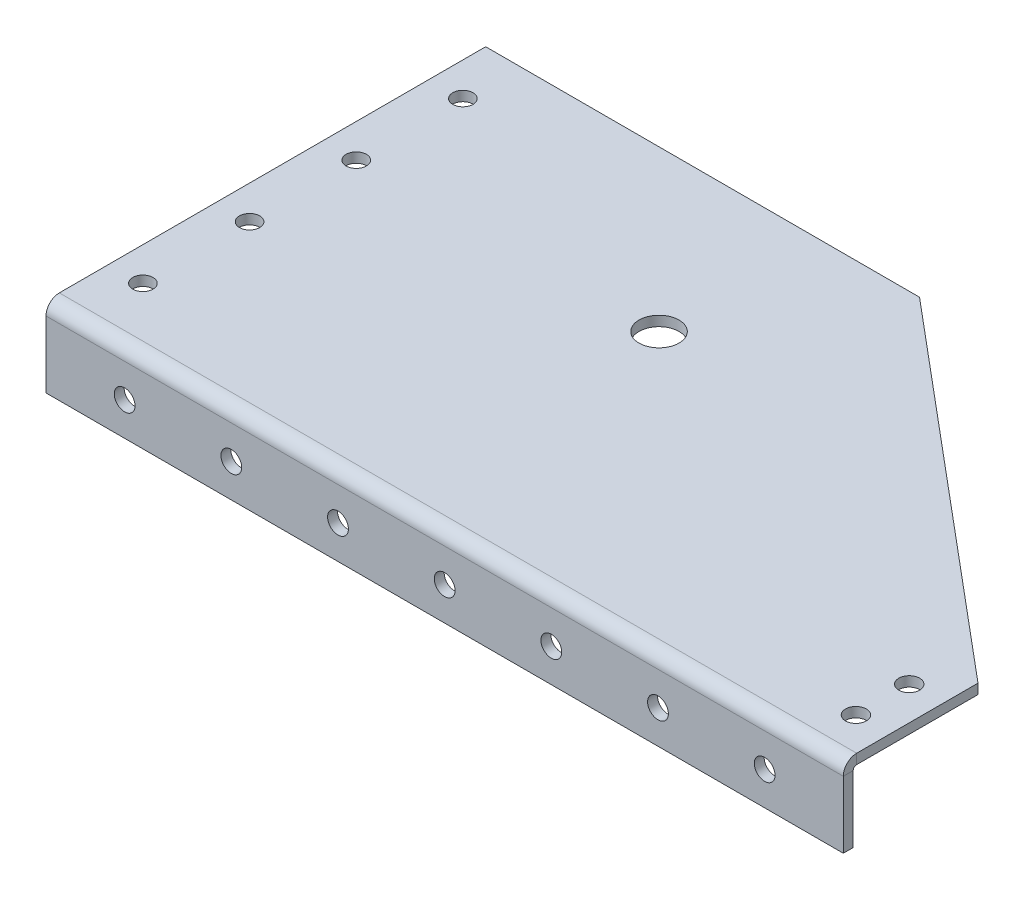
ISO-10303-21;
HEADER;
FILE_DESCRIPTION(('STEP AP214'),'2;1');
FILE_NAME('part.step','',(''),(''),'','','');
FILE_SCHEMA(('AUTOMOTIVE_DESIGN { 1 0 10303 214 1 1 1 1 }'));
ENDSEC;
DATA;
#1=APPLICATION_CONTEXT('core data for automotive mechanical design processes');
#2=APPLICATION_PROTOCOL_DEFINITION('international standard','automotive_design',2000,#1);
#3=PRODUCT_CONTEXT('',#1,'mechanical');
#4=PRODUCT('Part','Part','',(#3));
#5=PRODUCT_RELATED_PRODUCT_CATEGORY('part','',(#4));
#6=PRODUCT_DEFINITION_FORMATION('','',#4);
#7=PRODUCT_DEFINITION_CONTEXT('part definition',#1,'design');
#8=PRODUCT_DEFINITION('design','',#6,#7);
#9=PRODUCT_DEFINITION_SHAPE('','',#8);
#10=(LENGTH_UNIT() NAMED_UNIT(*) SI_UNIT(.MILLI.,.METRE.));
#11=(NAMED_UNIT(*) PLANE_ANGLE_UNIT() SI_UNIT($,.RADIAN.));
#12=(NAMED_UNIT(*) SI_UNIT($,.STERADIAN.) SOLID_ANGLE_UNIT());
#13=UNCERTAINTY_MEASURE_WITH_UNIT(LENGTH_MEASURE(1.E-05),#10,'distance_accuracy_value','');
#14=(GEOMETRIC_REPRESENTATION_CONTEXT(3) GLOBAL_UNCERTAINTY_ASSIGNED_CONTEXT((#13)) GLOBAL_UNIT_ASSIGNED_CONTEXT((#10,
#11,#12)) REPRESENTATION_CONTEXT('',''));
#15=CARTESIAN_POINT('',(0.,0.,0.));
#16=DIRECTION('',(0.,0.,1.));
#17=DIRECTION('',(1.,0.,0.));
#18=AXIS2_PLACEMENT_3D('',#15,#16,#17);
#19=CARTESIAN_POINT('',(-82.3158000000124,-2.3622,80.6769999999986));
#20=DIRECTION('',(-1.,0.,0.));
#21=DIRECTION('',(0.,0.,1.));
#22=AXIS2_PLACEMENT_3D('',#19,#20,#21);
#23=PLANE('',#22);
#24=DIRECTION('',(0.,0.,1.));
#25=VECTOR('',#24,1.);
#26=CARTESIAN_POINT('',(-82.3158000000124,0.,80.6769999999986));
#27=LINE('',#26,#25);
#28=CARTESIAN_POINT('',(-82.3158000000124,0.,-21.6596000000015));
#29=VERTEX_POINT('',#28);
#30=CARTESIAN_POINT('',(-82.3158000000124,0.,79.8641999999986));
#31=VERTEX_POINT('',#30);
#32=EDGE_CURVE('E195',#29,#31,#27,.T.);
#33=ORIENTED_EDGE('',*,*,#32,.F.);
#34=DIRECTION('',(0.,-1.,0.));
#35=VECTOR('',#34,1.);
#36=CARTESIAN_POINT('',(-82.3158000000124,0.,-21.6596000000015));
#37=LINE('',#36,#35);
#38=CARTESIAN_POINT('',(-82.3158000000124,-2.3622,-21.6596000000015));
#39=VERTEX_POINT('',#38);
#40=EDGE_CURVE('E123',#29,#39,#37,.T.);
#41=ORIENTED_EDGE('',*,*,#40,.T.);
#42=DIRECTION('',(0.,0.,1.));
#43=VECTOR('',#42,1.);
#44=CARTESIAN_POINT('',(-82.3158000000124,-2.3622,80.6769999999986));
#45=LINE('',#44,#43);
#46=CARTESIAN_POINT('',(-82.3158000000124,-2.36220000000001,79.8641999999985));
#47=VERTEX_POINT('',#46);
#48=EDGE_CURVE('E53',#39,#47,#45,.T.);
#49=ORIENTED_EDGE('',*,*,#48,.T.);
#50=DIRECTION('',(0.,1.,0.));
#51=VECTOR('',#50,1.);
#52=CARTESIAN_POINT('',(-82.3158000000124,-2.36220000000001,79.8641999999985));
#53=LINE('',#52,#51);
#54=EDGE_CURVE('E183',#47,#31,#53,.T.);
#55=ORIENTED_EDGE('',*,*,#54,.T.);
#56=EDGE_LOOP('',(#33,#41,#49,#55));
#57=FACE_BOUND('',#56,.T.);
#58=ADVANCED_FACE('F45',(#57),#23,.T.);
#59=CARTESIAN_POINT('',(0.,-2.3622,0.));
#60=DIRECTION('',(0.,1.,0.));
#61=DIRECTION('',(0.,0.,1.));
#62=AXIS2_PLACEMENT_3D('',#59,#60,#61);
#63=PLANE('',#62);
#64=CARTESIAN_POINT('',(-2.94080000001237,-2.3622,16.4403999999985));
#65=DIRECTION('',(0.,-1.,0.));
#66=DIRECTION('',(0.,0.,-1.));
#67=AXIS2_PLACEMENT_3D('',#64,#65,#66);
#68=CIRCLE('',#67,4.7625);
#69=CARTESIAN_POINT('',(-2.94080000001237,-2.3622,11.6778999999985));
#70=VERTEX_POINT('',#69);
#71=EDGE_CURVE('E331',#70,#70,#68,.T.);
#72=ORIENTED_EDGE('',*,*,#71,.F.);
#73=EDGE_LOOP('',(#72));
#74=FACE_BOUND('',#73,.T.);
#75=CARTESIAN_POINT('',(-74.3402000000121,-2.3622,-8.2596000000015));
#76=DIRECTION('',(0.,-1.,0.));
#77=DIRECTION('',(0.,0.,-1.));
#78=AXIS2_PLACEMENT_3D('',#75,#76,#77);
#79=CIRCLE('',#78,2.41300000000424);
#80=CARTESIAN_POINT('',(-74.3402000000121,-2.3622,-10.6726000000057));
#81=VERTEX_POINT('',#80);
#82=EDGE_CURVE('E339',#81,#81,#79,.T.);
#83=ORIENTED_EDGE('',*,*,#82,.F.);
#84=EDGE_LOOP('',(#83));
#85=FACE_BOUND('',#84,.T.);
#86=CARTESIAN_POINT('',(99.5657999997633,-2.3622,72.0664000001927));
#87=DIRECTION('',(0.,-1.,0.));
#88=DIRECTION('',(0.,0.,-1.));
#89=AXIS2_PLACEMENT_3D('',#86,#87,#88);
#90=CIRCLE('',#89,2.4765000002064);
#91=CARTESIAN_POINT('',(99.5657999997633,-2.3622,69.5898999999863));
#92=VERTEX_POINT('',#91);
#93=EDGE_CURVE('E332',#92,#92,#90,.T.);
#94=ORIENTED_EDGE('',*,*,#93,.F.);
#95=EDGE_LOOP('',(#94));
#96=FACE_BOUND('',#95,.T.);
#97=CARTESIAN_POINT('',(99.5657999997635,-2.3622,59.3664000001927));
#98=DIRECTION('',(0.,-1.,0.));
#99=DIRECTION('',(0.,0.,-1.));
#100=AXIS2_PLACEMENT_3D('',#97,#98,#99);
#101=CIRCLE('',#100,2.4765000002064);
#102=CARTESIAN_POINT('',(99.5657999997635,-2.3622,56.8898999999863));
#103=VERTEX_POINT('',#102);
#104=EDGE_CURVE('E348',#103,#103,#101,.T.);
#105=ORIENTED_EDGE('',*,*,#104,.F.);
#106=EDGE_LOOP('',(#105));
#107=FACE_BOUND('',#106,.T.);
#108=CARTESIAN_POINT('',(-74.3402000000129,-2.3622,67.9403999999985));
#109=DIRECTION('',(0.,-1.,0.));
#110=DIRECTION('',(0.,0.,-1.));
#111=AXIS2_PLACEMENT_3D('',#108,#109,#110);
#112=CIRCLE('',#111,2.41300000000423);
#113=CARTESIAN_POINT('',(-74.3402000000129,-2.3622,65.5273999999943));
#114=VERTEX_POINT('',#113);
#115=EDGE_CURVE('E364',#114,#114,#112,.T.);
#116=ORIENTED_EDGE('',*,*,#115,.F.);
#117=EDGE_LOOP('',(#116));
#118=FACE_BOUND('',#117,.T.);
#119=CARTESIAN_POINT('',(-74.3402000000127,-2.3622,42.5403999999985));
#120=DIRECTION('',(0.,-1.,0.));
#121=DIRECTION('',(0.,0.,-1.));
#122=AXIS2_PLACEMENT_3D('',#119,#120,#121);
#123=CIRCLE('',#122,2.41300000000424);
#124=CARTESIAN_POINT('',(-74.3402000000127,-2.3622,40.1273999999942));
#125=VERTEX_POINT('',#124);
#126=EDGE_CURVE('E358',#125,#125,#123,.T.);
#127=ORIENTED_EDGE('',*,*,#126,.F.);
#128=EDGE_LOOP('',(#127));
#129=FACE_BOUND('',#128,.T.);
#130=CARTESIAN_POINT('',(-74.3402000000124,-2.3622,17.1403999999985));
#131=DIRECTION('',(0.,-1.,0.));
#132=DIRECTION('',(0.,0.,-1.));
#133=AXIS2_PLACEMENT_3D('',#130,#131,#132);
#134=CIRCLE('',#133,2.41300000000424);
#135=CARTESIAN_POINT('',(-74.3402000000124,-2.3622,14.7273999999943));
#136=VERTEX_POINT('',#135);
#137=EDGE_CURVE('E352',#136,#136,#134,.T.);
#138=ORIENTED_EDGE('',*,*,#137,.F.);
#139=EDGE_LOOP('',(#138));
#140=FACE_BOUND('',#139,.T.);
#141=DIRECTION('',(0.766044443118979,0.,0.642787609686538));
#142=VECTOR('',#141,1.);
#143=CARTESIAN_POINT('',(19.3372412522365,-2.3622,-23.0452267332139));
#144=LINE('',#143,#142);
#145=CARTESIAN_POINT('',(20.9885668895371,-2.3622,-21.6596000000015));
#146=VERTEX_POINT('',#145);
#147=CARTESIAN_POINT('',(107.54140000001,-2.3622,50.966850340345));
#148=VERTEX_POINT('',#147);
#149=EDGE_CURVE('E129',#146,#148,#144,.T.);
#150=ORIENTED_EDGE('',*,*,#149,.T.);
#151=DIRECTION('',(0.,0.,-1.));
#152=VECTOR('',#151,1.);
#153=CARTESIAN_POINT('',(107.54140000001,-2.3622,80.6769999999985));
#154=LINE('',#153,#152);
#155=CARTESIAN_POINT('',(107.54140000001,-2.36220000000001,79.8641999999985));
#156=VERTEX_POINT('',#155);
#157=EDGE_CURVE('E11',#156,#148,#154,.T.);
#158=ORIENTED_EDGE('',*,*,#157,.F.);
#159=DIRECTION('',(-1.,0.,0.));
#160=VECTOR('',#159,1.);
#161=CARTESIAN_POINT('',(-82.3158000000124,-2.36220000000001,79.8641999999985));
#162=LINE('',#161,#160);
#163=EDGE_CURVE('E189',#47,#156,#162,.F.);
#164=ORIENTED_EDGE('',*,*,#163,.F.);
#165=ORIENTED_EDGE('',*,*,#48,.F.);
#166=DIRECTION('',(1.,0.,0.));
#167=VECTOR('',#166,1.);
#168=CARTESIAN_POINT('',(0.,-2.3622,-21.6596000000015));
#169=LINE('',#168,#167);
#170=EDGE_CURVE('E136',#39,#146,#169,.T.);
#171=ORIENTED_EDGE('',*,*,#170,.T.);
#172=EDGE_LOOP('',(#150,#158,#164,#165,#171));
#173=FACE_BOUND('',#172,.T.);
#174=ADVANCED_FACE('F209',(#74,#85,#96,#107,#118,#129,#140,#173),#63,.F.);
#175=CARTESIAN_POINT('',(0.,0.,0.));
#176=DIRECTION('',(0.,1.,0.));
#177=DIRECTION('',(0.,0.,1.));
#178=AXIS2_PLACEMENT_3D('',#175,#176,#177);
#179=PLANE('',#178);
#180=CARTESIAN_POINT('',(-2.94080000001237,0.,16.4403999999985));
#181=DIRECTION('',(0.,1.,0.));
#182=DIRECTION('',(0.,0.,1.));
#183=AXIS2_PLACEMENT_3D('',#180,#181,#182);
#184=CIRCLE('',#183,4.7625);
#185=CARTESIAN_POINT('',(-2.94080000001237,0.,21.2028999999985));
#186=VERTEX_POINT('',#185);
#187=EDGE_CURVE('E329',#186,#186,#184,.F.);
#188=ORIENTED_EDGE('',*,*,#187,.T.);
#189=EDGE_LOOP('',(#188));
#190=FACE_BOUND('',#189,.T.);
#191=CARTESIAN_POINT('',(-74.3402000000121,0.,-8.2596000000015));
#192=DIRECTION('',(0.,1.,0.));
#193=DIRECTION('',(0.,0.,1.));
#194=AXIS2_PLACEMENT_3D('',#191,#192,#193);
#195=CIRCLE('',#194,2.41300000000424);
#196=CARTESIAN_POINT('',(-74.3402000000121,0.,-5.84659999999725));
#197=VERTEX_POINT('',#196);
#198=EDGE_CURVE('E343',#197,#197,#195,.F.);
#199=ORIENTED_EDGE('',*,*,#198,.T.);
#200=EDGE_LOOP('',(#199));
#201=FACE_BOUND('',#200,.T.);
#202=CARTESIAN_POINT('',(99.5657999997633,0.,72.0664000001927));
#203=DIRECTION('',(0.,1.,0.));
#204=DIRECTION('',(0.,0.,1.));
#205=AXIS2_PLACEMENT_3D('',#202,#203,#204);
#206=CIRCLE('',#205,2.4765000002064);
#207=CARTESIAN_POINT('',(99.5657999997633,0.,74.5429000003991));
#208=VERTEX_POINT('',#207);
#209=EDGE_CURVE('E335',#208,#208,#206,.F.);
#210=ORIENTED_EDGE('',*,*,#209,.T.);
#211=EDGE_LOOP('',(#210));
#212=FACE_BOUND('',#211,.T.);
#213=CARTESIAN_POINT('',(99.5657999997635,0.,59.3664000001927));
#214=DIRECTION('',(0.,1.,0.));
#215=DIRECTION('',(0.,0.,1.));
#216=AXIS2_PLACEMENT_3D('',#213,#214,#215);
#217=CIRCLE('',#216,2.4765000002064);
#218=CARTESIAN_POINT('',(99.5657999997635,0.,61.8429000003991));
#219=VERTEX_POINT('',#218);
#220=EDGE_CURVE('E367',#219,#219,#217,.F.);
#221=ORIENTED_EDGE('',*,*,#220,.T.);
#222=EDGE_LOOP('',(#221));
#223=FACE_BOUND('',#222,.T.);
#224=CARTESIAN_POINT('',(-74.3402000000129,0.,67.9403999999985));
#225=DIRECTION('',(0.,1.,0.));
#226=DIRECTION('',(0.,0.,1.));
#227=AXIS2_PLACEMENT_3D('',#224,#225,#226);
#228=CIRCLE('',#227,2.41300000000423);
#229=CARTESIAN_POINT('',(-74.3402000000129,0.,70.3534000000027));
#230=VERTEX_POINT('',#229);
#231=EDGE_CURVE('E361',#230,#230,#228,.F.);
#232=ORIENTED_EDGE('',*,*,#231,.T.);
#233=EDGE_LOOP('',(#232));
#234=FACE_BOUND('',#233,.T.);
#235=CARTESIAN_POINT('',(-74.3402000000127,0.,42.5403999999985));
#236=DIRECTION('',(0.,1.,0.));
#237=DIRECTION('',(0.,0.,1.));
#238=AXIS2_PLACEMENT_3D('',#235,#236,#237);
#239=CIRCLE('',#238,2.41300000000424);
#240=CARTESIAN_POINT('',(-74.3402000000127,0.,44.9534000000027));
#241=VERTEX_POINT('',#240);
#242=EDGE_CURVE('E355',#241,#241,#239,.F.);
#243=ORIENTED_EDGE('',*,*,#242,.T.);
#244=EDGE_LOOP('',(#243));
#245=FACE_BOUND('',#244,.T.);
#246=CARTESIAN_POINT('',(-74.3402000000124,0.,17.1403999999985));
#247=DIRECTION('',(0.,1.,0.));
#248=DIRECTION('',(0.,0.,1.));
#249=AXIS2_PLACEMENT_3D('',#246,#247,#248);
#250=CIRCLE('',#249,2.41300000000424);
#251=CARTESIAN_POINT('',(-74.3402000000124,0.,19.5534000000027));
#252=VERTEX_POINT('',#251);
#253=EDGE_CURVE('E346',#252,#252,#250,.F.);
#254=ORIENTED_EDGE('',*,*,#253,.T.);
#255=EDGE_LOOP('',(#254));
#256=FACE_BOUND('',#255,.T.);
#257=DIRECTION('',(0.,0.,-1.));
#258=VECTOR('',#257,1.);
#259=CARTESIAN_POINT('',(107.54140000001,0.,80.6769999999985));
#260=LINE('',#259,#258);
#261=CARTESIAN_POINT('',(107.54140000001,0.,79.8641999999985));
#262=VERTEX_POINT('',#261);
#263=CARTESIAN_POINT('',(107.54140000001,0.,50.966850340345));
#264=VERTEX_POINT('',#263);
#265=EDGE_CURVE('E48',#262,#264,#260,.T.);
#266=ORIENTED_EDGE('',*,*,#265,.T.);
#267=DIRECTION('',(0.766044443118979,0.,0.642787609686538));
#268=VECTOR('',#267,1.);
#269=CARTESIAN_POINT('',(19.3372412522365,0.,-23.0452267332139));
#270=LINE('',#269,#268);
#271=CARTESIAN_POINT('',(20.9885668895371,0.,-21.6596000000015));
#272=VERTEX_POINT('',#271);
#273=EDGE_CURVE('E61',#272,#264,#270,.T.);
#274=ORIENTED_EDGE('',*,*,#273,.F.);
#275=DIRECTION('',(1.,0.,0.));
#276=VECTOR('',#275,1.);
#277=CARTESIAN_POINT('',(0.,0.,-21.6596000000015));
#278=LINE('',#277,#276);
#279=EDGE_CURVE('E118',#29,#272,#278,.T.);
#280=ORIENTED_EDGE('',*,*,#279,.F.);
#281=ORIENTED_EDGE('',*,*,#32,.T.);
#282=DIRECTION('',(-1.,0.,0.));
#283=VECTOR('',#282,1.);
#284=CARTESIAN_POINT('',(-82.3158000000124,0.,79.8641999999986));
#285=LINE('',#284,#283);
#286=EDGE_CURVE('E179',#31,#262,#285,.F.);
#287=ORIENTED_EDGE('',*,*,#286,.T.);
#288=EDGE_LOOP('',(#266,#274,#280,#281,#287));
#289=FACE_BOUND('',#288,.T.);
#290=ADVANCED_FACE('F133',(#190,#201,#212,#223,#234,#245,#256,#289),#179,.T.);
#291=CARTESIAN_POINT('',(107.54140000001,-2.3622,80.6769999999985));
#292=DIRECTION('',(1.,0.,0.));
#293=DIRECTION('',(0.,0.,-1.));
#294=AXIS2_PLACEMENT_3D('',#291,#292,#293);
#295=PLANE('',#294);
#296=ORIENTED_EDGE('',*,*,#157,.T.);
#297=DIRECTION('',(0.,-1.,0.));
#298=VECTOR('',#297,1.);
#299=CARTESIAN_POINT('',(107.54140000001,0.,50.966850340345));
#300=LINE('',#299,#298);
#301=EDGE_CURVE('E145',#264,#148,#300,.T.);
#302=ORIENTED_EDGE('',*,*,#301,.F.);
#303=ORIENTED_EDGE('',*,*,#265,.F.);
#304=DIRECTION('',(0.,1.,0.));
#305=VECTOR('',#304,1.);
#306=CARTESIAN_POINT('',(107.54140000001,-2.36220000000001,79.8641999999985));
#307=LINE('',#306,#305);
#308=EDGE_CURVE('E193',#156,#262,#307,.T.);
#309=ORIENTED_EDGE('',*,*,#308,.F.);
#310=EDGE_LOOP('',(#296,#302,#303,#309));
#311=FACE_BOUND('',#310,.T.);
#312=ADVANCED_FACE('F219',(#311),#295,.T.);
#313=CARTESIAN_POINT('',(107.54140000001,-3.175,79.8641999999985));
#314=DIRECTION('',(1.,0.,0.));
#315=DIRECTION('',(0.,0.,-1.));
#316=AXIS2_PLACEMENT_3D('',#313,#314,#315);
#317=PLANE('',#316);
#318=DIRECTION('',(0.,0.,1.));
#319=VECTOR('',#318,1.);
#320=CARTESIAN_POINT('',(107.54140000001,-3.175,80.6769999999985));
#321=LINE('',#320,#319);
#322=CARTESIAN_POINT('',(107.54140000001,-3.17499999999999,80.6769999999985));
#323=VERTEX_POINT('',#322);
#324=CARTESIAN_POINT('',(107.54140000001,-3.17499999999999,83.0391999999985));
#325=VERTEX_POINT('',#324);
#326=EDGE_CURVE('E147',#323,#325,#321,.T.);
#327=ORIENTED_EDGE('',*,*,#326,.F.);
#328=CARTESIAN_POINT('',(107.54140000001,-3.175,79.8641999999985));
#329=DIRECTION('',(-1.,0.,0.));
#330=DIRECTION('',(0.,0.,1.));
#331=AXIS2_PLACEMENT_3D('',#328,#329,#330);
#332=CIRCLE('',#331,0.812799999999989);
#333=EDGE_CURVE('E186',#156,#323,#332,.F.);
#334=ORIENTED_EDGE('',*,*,#333,.F.);
#335=ORIENTED_EDGE('',*,*,#308,.T.);
#336=CARTESIAN_POINT('',(107.54140000001,-3.175,79.8641999999985));
#337=DIRECTION('',(-1.,0.,0.));
#338=DIRECTION('',(0.,0.,1.));
#339=AXIS2_PLACEMENT_3D('',#336,#337,#338);
#340=CIRCLE('',#339,3.17499999999999);
#341=EDGE_CURVE('E69',#262,#325,#340,.F.);
#342=ORIENTED_EDGE('',*,*,#341,.T.);
#343=EDGE_LOOP('',(#327,#334,#335,#342));
#344=FACE_BOUND('',#343,.T.);
#345=ADVANCED_FACE('F217',(#344),#317,.T.);
#346=CARTESIAN_POINT('',(-82.3158000000124,-3.175,79.8641999999985));
#347=DIRECTION('',(1.,0.,0.));
#348=DIRECTION('',(0.,0.,-1.));
#349=AXIS2_PLACEMENT_3D('',#346,#347,#348);
#350=PLANE('',#349);
#351=CARTESIAN_POINT('',(-82.3158000000124,-3.175,79.8641999999985));
#352=DIRECTION('',(-1.,0.,0.));
#353=DIRECTION('',(0.,0.,1.));
#354=AXIS2_PLACEMENT_3D('',#351,#352,#353);
#355=CIRCLE('',#354,0.812799999999989);
#356=CARTESIAN_POINT('',(-82.3158000000124,-3.17499999999999,80.6769999999985));
#357=VERTEX_POINT('',#356);
#358=EDGE_CURVE('E178',#357,#47,#355,.T.);
#359=ORIENTED_EDGE('',*,*,#358,.F.);
#360=DIRECTION('',(0.,0.,1.));
#361=VECTOR('',#360,1.);
#362=CARTESIAN_POINT('',(-82.3158000000124,-3.175,80.6769999999986));
#363=LINE('',#362,#361);
#364=CARTESIAN_POINT('',(-82.3158000000124,-3.175,83.0391999999985));
#365=VERTEX_POINT('',#364);
#366=EDGE_CURVE('E151',#357,#365,#363,.T.);
#367=ORIENTED_EDGE('',*,*,#366,.T.);
#368=CARTESIAN_POINT('',(-82.3158000000124,-3.175,79.8641999999985));
#369=DIRECTION('',(-1.,0.,0.));
#370=DIRECTION('',(0.,0.,1.));
#371=AXIS2_PLACEMENT_3D('',#368,#369,#370);
#372=CIRCLE('',#371,3.17499999999999);
#373=EDGE_CURVE('E181',#365,#31,#372,.T.);
#374=ORIENTED_EDGE('',*,*,#373,.T.);
#375=ORIENTED_EDGE('',*,*,#54,.F.);
#376=EDGE_LOOP('',(#359,#367,#374,#375));
#377=FACE_BOUND('',#376,.T.);
#378=ADVANCED_FACE('F203',(#377),#350,.F.);
#379=CARTESIAN_POINT('',(-82.3158000000124,-3.175,79.8641999999985));
#380=DIRECTION('',(-1.,0.,0.));
#381=DIRECTION('',(0.,0.,1.));
#382=AXIS2_PLACEMENT_3D('',#379,#380,#381);
#383=CYLINDRICAL_SURFACE('',#382,3.17499999999999);
#384=ORIENTED_EDGE('',*,*,#286,.F.);
#385=ORIENTED_EDGE('',*,*,#373,.F.);
#386=DIRECTION('',(1.,0.,0.));
#387=VECTOR('',#386,1.);
#388=CARTESIAN_POINT('',(0.,-3.175,83.0391999999985));
#389=LINE('',#388,#387);
#390=EDGE_CURVE('E154',#365,#325,#389,.T.);
#391=ORIENTED_EDGE('',*,*,#390,.T.);
#392=ORIENTED_EDGE('',*,*,#341,.F.);
#393=EDGE_LOOP('',(#384,#385,#391,#392));
#394=FACE_BOUND('',#393,.T.);
#395=ADVANCED_FACE('F199',(#394),#383,.T.);
#396=CARTESIAN_POINT('',(-82.3158000000124,-3.175,79.8641999999985));
#397=DIRECTION('',(-1.,0.,0.));
#398=DIRECTION('',(0.,0.,1.));
#399=AXIS2_PLACEMENT_3D('',#396,#397,#398);
#400=CYLINDRICAL_SURFACE('',#399,0.812799999999989);
#401=ORIENTED_EDGE('',*,*,#163,.T.);
#402=ORIENTED_EDGE('',*,*,#333,.T.);
#403=DIRECTION('',(-1.,0.,0.));
#404=VECTOR('',#403,1.);
#405=CARTESIAN_POINT('',(107.54140000001,-3.175,80.6769999999985));
#406=LINE('',#405,#404);
#407=EDGE_CURVE('E149',#323,#357,#406,.T.);
#408=ORIENTED_EDGE('',*,*,#407,.T.);
#409=ORIENTED_EDGE('',*,*,#358,.T.);
#410=EDGE_LOOP('',(#401,#402,#408,#409));
#411=FACE_BOUND('',#410,.T.);
#412=ADVANCED_FACE('F213',(#411),#400,.F.);
#413=CARTESIAN_POINT('',(-82.3158000000124,-19.05,83.0391999999986));
#414=DIRECTION('',(1.,0.,0.));
#415=DIRECTION('',(0.,1.,0.));
#416=AXIS2_PLACEMENT_3D('',#413,#414,#415);
#417=PLANE('',#416);
#418=ORIENTED_EDGE('',*,*,#366,.F.);
#419=DIRECTION('',(0.,-1.,0.));
#420=VECTOR('',#419,1.);
#421=CARTESIAN_POINT('',(-82.3158000000124,-19.05,80.6769999999986));
#422=LINE('',#421,#420);
#423=CARTESIAN_POINT('',(-82.3158000000124,-19.05,80.6769999999986));
#424=VERTEX_POINT('',#423);
#425=EDGE_CURVE('E158',#357,#424,#422,.T.);
#426=ORIENTED_EDGE('',*,*,#425,.T.);
#427=DIRECTION('',(0.,0.,-1.));
#428=VECTOR('',#427,1.);
#429=CARTESIAN_POINT('',(-82.3158000000124,-19.05,83.0391999999986));
#430=LINE('',#429,#428);
#431=CARTESIAN_POINT('',(-82.3158000000124,-19.05,83.0391999999986));
#432=VERTEX_POINT('',#431);
#433=EDGE_CURVE('E175',#432,#424,#430,.T.);
#434=ORIENTED_EDGE('',*,*,#433,.F.);
#435=DIRECTION('',(0.,-1.,0.));
#436=VECTOR('',#435,1.);
#437=CARTESIAN_POINT('',(-82.3158000000124,-19.05,83.0391999999986));
#438=LINE('',#437,#436);
#439=EDGE_CURVE('E159',#365,#432,#438,.T.);
#440=ORIENTED_EDGE('',*,*,#439,.F.);
#441=EDGE_LOOP('',(#418,#426,#434,#440));
#442=FACE_BOUND('',#441,.T.);
#443=ADVANCED_FACE('F246',(#442),#417,.F.);
#444=CARTESIAN_POINT('',(107.54140000001,-2.36219999999999,83.0391999999985));
#445=DIRECTION('',(-1.,0.,0.));
#446=DIRECTION('',(0.,0.,1.));
#447=AXIS2_PLACEMENT_3D('',#444,#445,#446);
#448=PLANE('',#447);
#449=ORIENTED_EDGE('',*,*,#326,.T.);
#450=DIRECTION('',(0.,1.,0.));
#451=VECTOR('',#450,1.);
#452=CARTESIAN_POINT('',(107.54140000001,-2.36219999999999,83.0391999999985));
#453=LINE('',#452,#451);
#454=CARTESIAN_POINT('',(107.54140000001,-19.05,83.0391999999986));
#455=VERTEX_POINT('',#454);
#456=EDGE_CURVE('E164',#455,#325,#453,.T.);
#457=ORIENTED_EDGE('',*,*,#456,.F.);
#458=DIRECTION('',(0.,0.,-1.));
#459=VECTOR('',#458,1.);
#460=CARTESIAN_POINT('',(107.54140000001,-19.05,83.0391999999986));
#461=LINE('',#460,#459);
#462=CARTESIAN_POINT('',(107.54140000001,-19.05,80.6769999999986));
#463=VERTEX_POINT('',#462);
#464=EDGE_CURVE('E167',#455,#463,#461,.T.);
#465=ORIENTED_EDGE('',*,*,#464,.T.);
#466=DIRECTION('',(0.,1.,0.));
#467=VECTOR('',#466,1.);
#468=CARTESIAN_POINT('',(107.54140000001,-2.3622,80.6769999999985));
#469=LINE('',#468,#467);
#470=EDGE_CURVE('E162',#463,#323,#469,.T.);
#471=ORIENTED_EDGE('',*,*,#470,.T.);
#472=EDGE_LOOP('',(#449,#457,#465,#471));
#473=FACE_BOUND('',#472,.T.);
#474=ADVANCED_FACE('F251',(#473),#448,.F.);
#475=CARTESIAN_POINT('',(0.,2.76615675343239E-13,83.0391999999985));
#476=DIRECTION('',(0.,0.,-1.));
#477=DIRECTION('',(0.,1.,0.));
#478=AXIS2_PLACEMENT_3D('',#475,#476,#477);
#479=PLANE('',#478);
#480=CARTESIAN_POINT('',(-63.587200000001,-11.1125,83.0391999999986));
#481=DIRECTION('',(0.,0.,-1.));
#482=DIRECTION('',(0.,1.,0.));
#483=AXIS2_PLACEMENT_3D('',#480,#481,#482);
#484=CIRCLE('',#483,2.4765);
#485=CARTESIAN_POINT('',(-63.587200000001,-8.636,83.0391999999986));
#486=VERTEX_POINT('',#485);
#487=EDGE_CURVE('E143',#486,#486,#484,.F.);
#488=ORIENTED_EDGE('',*,*,#487,.F.);
#489=EDGE_LOOP('',(#488));
#490=FACE_BOUND('',#489,.T.);
#491=CARTESIAN_POINT('',(88.812799999999,-11.1125,83.0391999999986));
#492=DIRECTION('',(0.,0.,-1.));
#493=DIRECTION('',(0.,1.,0.));
#494=AXIS2_PLACEMENT_3D('',#491,#492,#493);
#495=CIRCLE('',#494,2.4765);
#496=CARTESIAN_POINT('',(88.812799999999,-8.636,83.0391999999985));
#497=VERTEX_POINT('',#496);
#498=EDGE_CURVE('E378',#497,#497,#495,.F.);
#499=ORIENTED_EDGE('',*,*,#498,.F.);
#500=EDGE_LOOP('',(#499));
#501=FACE_BOUND('',#500,.T.);
#502=CARTESIAN_POINT('',(63.412799999999,-11.1125,83.0391999999986));
#503=DIRECTION('',(0.,0.,-1.));
#504=DIRECTION('',(0.,1.,0.));
#505=AXIS2_PLACEMENT_3D('',#502,#503,#504);
#506=CIRCLE('',#505,2.4765);
#507=CARTESIAN_POINT('',(63.412799999999,-8.63600000000001,83.0391999999985));
#508=VERTEX_POINT('',#507);
#509=EDGE_CURVE('E384',#508,#508,#506,.F.);
#510=ORIENTED_EDGE('',*,*,#509,.F.);
#511=EDGE_LOOP('',(#510));
#512=FACE_BOUND('',#511,.T.);
#513=CARTESIAN_POINT('',(38.012799999999,-11.1125,83.0391999999986));
#514=DIRECTION('',(0.,0.,-1.));
#515=DIRECTION('',(0.,1.,0.));
#516=AXIS2_PLACEMENT_3D('',#513,#514,#515);
#517=CIRCLE('',#516,2.4765);
#518=CARTESIAN_POINT('',(38.012799999999,-8.63600000000001,83.0391999999985));
#519=VERTEX_POINT('',#518);
#520=EDGE_CURVE('E390',#519,#519,#517,.F.);
#521=ORIENTED_EDGE('',*,*,#520,.F.);
#522=EDGE_LOOP('',(#521));
#523=FACE_BOUND('',#522,.T.);
#524=CARTESIAN_POINT('',(12.612799999999,-11.1125,83.0391999999986));
#525=DIRECTION('',(0.,0.,-1.));
#526=DIRECTION('',(0.,1.,0.));
#527=AXIS2_PLACEMENT_3D('',#524,#525,#526);
#528=CIRCLE('',#527,2.4765);
#529=CARTESIAN_POINT('',(12.612799999999,-8.636,83.0391999999986));
#530=VERTEX_POINT('',#529);
#531=EDGE_CURVE('E396',#530,#530,#528,.F.);
#532=ORIENTED_EDGE('',*,*,#531,.F.);
#533=EDGE_LOOP('',(#532));
#534=FACE_BOUND('',#533,.T.);
#535=CARTESIAN_POINT('',(-12.787200000001,-11.1125,83.0391999999986));
#536=DIRECTION('',(0.,0.,-1.));
#537=DIRECTION('',(0.,1.,0.));
#538=AXIS2_PLACEMENT_3D('',#535,#536,#537);
#539=CIRCLE('',#538,2.4765);
#540=CARTESIAN_POINT('',(-12.787200000001,-8.636,83.0391999999986));
#541=VERTEX_POINT('',#540);
#542=EDGE_CURVE('E402',#541,#541,#539,.F.);
#543=ORIENTED_EDGE('',*,*,#542,.F.);
#544=EDGE_LOOP('',(#543));
#545=FACE_BOUND('',#544,.T.);
#546=CARTESIAN_POINT('',(-38.187200000001,-11.1125,83.0391999999986));
#547=DIRECTION('',(0.,0.,-1.));
#548=DIRECTION('',(0.,1.,0.));
#549=AXIS2_PLACEMENT_3D('',#546,#547,#548);
#550=CIRCLE('',#549,2.4765);
#551=CARTESIAN_POINT('',(-38.187200000001,-8.63600000000001,83.0391999999986));
#552=VERTEX_POINT('',#551);
#553=EDGE_CURVE('E342',#552,#552,#550,.F.);
#554=ORIENTED_EDGE('',*,*,#553,.F.);
#555=EDGE_LOOP('',(#554));
#556=FACE_BOUND('',#555,.T.);
#557=ORIENTED_EDGE('',*,*,#390,.F.);
#558=ORIENTED_EDGE('',*,*,#439,.T.);
#559=DIRECTION('',(1.,0.,0.));
#560=VECTOR('',#559,1.);
#561=CARTESIAN_POINT('',(107.54140000001,-19.05,83.0391999999986));
#562=LINE('',#561,#560);
#563=EDGE_CURVE('E161',#432,#455,#562,.T.);
#564=ORIENTED_EDGE('',*,*,#563,.T.);
#565=ORIENTED_EDGE('',*,*,#456,.T.);
#566=EDGE_LOOP('',(#557,#558,#564,#565));
#567=FACE_BOUND('',#566,.T.);
#568=ADVANCED_FACE('F259',(#490,#501,#512,#523,#534,#545,#556,#567),#479,.F.);
#569=CARTESIAN_POINT('',(0.,2.68368098124624E-13,80.6769999999985));
#570=DIRECTION('',(0.,0.,-1.));
#571=DIRECTION('',(0.,1.,0.));
#572=AXIS2_PLACEMENT_3D('',#569,#570,#571);
#573=PLANE('',#572);
#574=CARTESIAN_POINT('',(-63.587200000001,-11.1125,80.6769999999986));
#575=DIRECTION('',(0.,0.,-1.));
#576=DIRECTION('',(0.,1.,0.));
#577=AXIS2_PLACEMENT_3D('',#574,#575,#576);
#578=CIRCLE('',#577,2.4765);
#579=CARTESIAN_POINT('',(-63.587200000001,-8.63600000000001,80.6769999999986));
#580=VERTEX_POINT('',#579);
#581=EDGE_CURVE('E372',#580,#580,#578,.T.);
#582=ORIENTED_EDGE('',*,*,#581,.F.);
#583=EDGE_LOOP('',(#582));
#584=FACE_BOUND('',#583,.T.);
#585=CARTESIAN_POINT('',(88.812799999999,-11.1125,80.6769999999986));
#586=DIRECTION('',(0.,0.,-1.));
#587=DIRECTION('',(0.,1.,0.));
#588=AXIS2_PLACEMENT_3D('',#585,#586,#587);
#589=CIRCLE('',#588,2.4765);
#590=CARTESIAN_POINT('',(88.812799999999,-8.63600000000001,80.6769999999986));
#591=VERTEX_POINT('',#590);
#592=EDGE_CURVE('E375',#591,#591,#589,.T.);
#593=ORIENTED_EDGE('',*,*,#592,.F.);
#594=EDGE_LOOP('',(#593));
#595=FACE_BOUND('',#594,.T.);
#596=CARTESIAN_POINT('',(63.412799999999,-11.1125,80.6769999999986));
#597=DIRECTION('',(0.,0.,-1.));
#598=DIRECTION('',(0.,1.,0.));
#599=AXIS2_PLACEMENT_3D('',#596,#597,#598);
#600=CIRCLE('',#599,2.4765);
#601=CARTESIAN_POINT('',(63.412799999999,-8.63600000000002,80.6769999999986));
#602=VERTEX_POINT('',#601);
#603=EDGE_CURVE('E381',#602,#602,#600,.T.);
#604=ORIENTED_EDGE('',*,*,#603,.F.);
#605=EDGE_LOOP('',(#604));
#606=FACE_BOUND('',#605,.T.);
#607=CARTESIAN_POINT('',(38.012799999999,-11.1125,80.6769999999986));
#608=DIRECTION('',(0.,0.,-1.));
#609=DIRECTION('',(0.,1.,0.));
#610=AXIS2_PLACEMENT_3D('',#607,#608,#609);
#611=CIRCLE('',#610,2.4765);
#612=CARTESIAN_POINT('',(38.012799999999,-8.63600000000002,80.6769999999986));
#613=VERTEX_POINT('',#612);
#614=EDGE_CURVE('E387',#613,#613,#611,.T.);
#615=ORIENTED_EDGE('',*,*,#614,.F.);
#616=EDGE_LOOP('',(#615));
#617=FACE_BOUND('',#616,.T.);
#618=CARTESIAN_POINT('',(12.612799999999,-11.1125,80.6769999999986));
#619=DIRECTION('',(0.,0.,-1.));
#620=DIRECTION('',(0.,1.,0.));
#621=AXIS2_PLACEMENT_3D('',#618,#619,#620);
#622=CIRCLE('',#621,2.4765);
#623=CARTESIAN_POINT('',(12.612799999999,-8.63600000000001,80.6769999999986));
#624=VERTEX_POINT('',#623);
#625=EDGE_CURVE('E393',#624,#624,#622,.T.);
#626=ORIENTED_EDGE('',*,*,#625,.F.);
#627=EDGE_LOOP('',(#626));
#628=FACE_BOUND('',#627,.T.);
#629=CARTESIAN_POINT('',(-12.787200000001,-11.1125,80.6769999999986));
#630=DIRECTION('',(0.,0.,-1.));
#631=DIRECTION('',(0.,1.,0.));
#632=AXIS2_PLACEMENT_3D('',#629,#630,#631);
#633=CIRCLE('',#632,2.4765);
#634=CARTESIAN_POINT('',(-12.787200000001,-8.63600000000001,80.6769999999986));
#635=VERTEX_POINT('',#634);
#636=EDGE_CURVE('E399',#635,#635,#633,.T.);
#637=ORIENTED_EDGE('',*,*,#636,.F.);
#638=EDGE_LOOP('',(#637));
#639=FACE_BOUND('',#638,.T.);
#640=CARTESIAN_POINT('',(-38.187200000001,-11.1125,80.6769999999986));
#641=DIRECTION('',(0.,0.,-1.));
#642=DIRECTION('',(0.,1.,0.));
#643=AXIS2_PLACEMENT_3D('',#640,#641,#642);
#644=CIRCLE('',#643,2.4765);
#645=CARTESIAN_POINT('',(-38.187200000001,-8.63600000000002,80.6769999999986));
#646=VERTEX_POINT('',#645);
#647=EDGE_CURVE('E140',#646,#646,#644,.T.);
#648=ORIENTED_EDGE('',*,*,#647,.F.);
#649=EDGE_LOOP('',(#648));
#650=FACE_BOUND('',#649,.T.);
#651=ORIENTED_EDGE('',*,*,#425,.F.);
#652=ORIENTED_EDGE('',*,*,#407,.F.);
#653=ORIENTED_EDGE('',*,*,#470,.F.);
#654=DIRECTION('',(1.,0.,0.));
#655=VECTOR('',#654,1.);
#656=CARTESIAN_POINT('',(107.54140000001,-19.05,80.6769999999986));
#657=LINE('',#656,#655);
#658=EDGE_CURVE('E169',#424,#463,#657,.T.);
#659=ORIENTED_EDGE('',*,*,#658,.F.);
#660=EDGE_LOOP('',(#651,#652,#653,#659));
#661=FACE_BOUND('',#660,.T.);
#662=ADVANCED_FACE('F255',(#584,#595,#606,#617,#628,#639,#650,#661),#573,.T.);
#663=CARTESIAN_POINT('',(107.54140000001,-19.05,83.0391999999986));
#664=DIRECTION('',(0.,1.,0.));
#665=DIRECTION('',(0.,0.,1.));
#666=AXIS2_PLACEMENT_3D('',#663,#664,#665);
#667=PLANE('',#666);
#668=ORIENTED_EDGE('',*,*,#658,.T.);
#669=ORIENTED_EDGE('',*,*,#464,.F.);
#670=ORIENTED_EDGE('',*,*,#563,.F.);
#671=ORIENTED_EDGE('',*,*,#433,.T.);
#672=EDGE_LOOP('',(#668,#669,#670,#671));
#673=FACE_BOUND('',#672,.T.);
#674=ADVANCED_FACE('F253',(#673),#667,.F.);
#675=CARTESIAN_POINT('',(19.3372412522365,0.,-23.0452267332139));
#676=DIRECTION('',(0.642787609686538,0.,-0.766044443118979));
#677=DIRECTION('',(-0.766044443118979,0.,-0.642787609686538));
#678=AXIS2_PLACEMENT_3D('',#675,#676,#677);
#679=PLANE('',#678);
#680=ORIENTED_EDGE('',*,*,#149,.F.);
#681=DIRECTION('',(0.,-1.,0.));
#682=VECTOR('',#681,1.);
#683=CARTESIAN_POINT('',(20.9885668895371,0.,-21.6596000000015));
#684=LINE('',#683,#682);
#685=EDGE_CURVE('E120',#272,#146,#684,.T.);
#686=ORIENTED_EDGE('',*,*,#685,.F.);
#687=ORIENTED_EDGE('',*,*,#273,.T.);
#688=ORIENTED_EDGE('',*,*,#301,.T.);
#689=EDGE_LOOP('',(#680,#686,#687,#688));
#690=FACE_BOUND('',#689,.T.);
#691=ADVANCED_FACE('F127',(#690),#679,.T.);
#692=CARTESIAN_POINT('',(0.,0.,-21.6596000000015));
#693=DIRECTION('',(0.,0.,-1.));
#694=DIRECTION('',(-1.,0.,0.));
#695=AXIS2_PLACEMENT_3D('',#692,#693,#694);
#696=PLANE('',#695);
#697=ORIENTED_EDGE('',*,*,#170,.F.);
#698=ORIENTED_EDGE('',*,*,#40,.F.);
#699=ORIENTED_EDGE('',*,*,#279,.T.);
#700=ORIENTED_EDGE('',*,*,#685,.T.);
#701=EDGE_LOOP('',(#697,#698,#699,#700));
#702=FACE_BOUND('',#701,.T.);
#703=ADVANCED_FACE('F119',(#702),#696,.T.);
#704=CARTESIAN_POINT('',(-38.187200000001,-11.1125,83.0401999999987));
#705=DIRECTION('',(0.,0.,-1.));
#706=DIRECTION('',(0.,1.,0.));
#707=AXIS2_PLACEMENT_3D('',#704,#705,#706);
#708=CYLINDRICAL_SURFACE('',#707,2.4765);
#709=ORIENTED_EDGE('',*,*,#647,.T.);
#710=EDGE_LOOP('',(#709));
#711=FACE_BOUND('',#710,.T.);
#712=ORIENTED_EDGE('',*,*,#553,.T.);
#713=EDGE_LOOP('',(#712));
#714=FACE_BOUND('',#713,.T.);
#715=ADVANCED_FACE('F270',(#711,#714),#708,.F.);
#716=CARTESIAN_POINT('',(-12.787200000001,-11.1125,83.0401999999987));
#717=DIRECTION('',(0.,0.,-1.));
#718=DIRECTION('',(0.,1.,0.));
#719=AXIS2_PLACEMENT_3D('',#716,#717,#718);
#720=CYLINDRICAL_SURFACE('',#719,2.4765);
#721=ORIENTED_EDGE('',*,*,#636,.T.);
#722=EDGE_LOOP('',(#721));
#723=FACE_BOUND('',#722,.T.);
#724=ORIENTED_EDGE('',*,*,#542,.T.);
#725=EDGE_LOOP('',(#724));
#726=FACE_BOUND('',#725,.T.);
#727=ADVANCED_FACE('F273',(#723,#726),#720,.F.);
#728=CARTESIAN_POINT('',(12.612799999999,-11.1125,83.0401999999987));
#729=DIRECTION('',(0.,0.,-1.));
#730=DIRECTION('',(0.,1.,0.));
#731=AXIS2_PLACEMENT_3D('',#728,#729,#730);
#732=CYLINDRICAL_SURFACE('',#731,2.4765);
#733=ORIENTED_EDGE('',*,*,#625,.T.);
#734=EDGE_LOOP('',(#733));
#735=FACE_BOUND('',#734,.T.);
#736=ORIENTED_EDGE('',*,*,#531,.T.);
#737=EDGE_LOOP('',(#736));
#738=FACE_BOUND('',#737,.T.);
#739=ADVANCED_FACE('F277',(#735,#738),#732,.F.);
#740=CARTESIAN_POINT('',(38.012799999999,-11.1125,83.0401999999987));
#741=DIRECTION('',(0.,0.,-1.));
#742=DIRECTION('',(0.,1.,0.));
#743=AXIS2_PLACEMENT_3D('',#740,#741,#742);
#744=CYLINDRICAL_SURFACE('',#743,2.4765);
#745=ORIENTED_EDGE('',*,*,#614,.T.);
#746=EDGE_LOOP('',(#745));
#747=FACE_BOUND('',#746,.T.);
#748=ORIENTED_EDGE('',*,*,#520,.T.);
#749=EDGE_LOOP('',(#748));
#750=FACE_BOUND('',#749,.T.);
#751=ADVANCED_FACE('F281',(#747,#750),#744,.F.);
#752=CARTESIAN_POINT('',(63.412799999999,-11.1125,83.0401999999987));
#753=DIRECTION('',(0.,0.,-1.));
#754=DIRECTION('',(0.,1.,0.));
#755=AXIS2_PLACEMENT_3D('',#752,#753,#754);
#756=CYLINDRICAL_SURFACE('',#755,2.4765);
#757=ORIENTED_EDGE('',*,*,#603,.T.);
#758=EDGE_LOOP('',(#757));
#759=FACE_BOUND('',#758,.T.);
#760=ORIENTED_EDGE('',*,*,#509,.T.);
#761=EDGE_LOOP('',(#760));
#762=FACE_BOUND('',#761,.T.);
#763=ADVANCED_FACE('F285',(#759,#762),#756,.F.);
#764=CARTESIAN_POINT('',(88.812799999999,-11.1125,83.0401999999987));
#765=DIRECTION('',(0.,0.,-1.));
#766=DIRECTION('',(0.,1.,0.));
#767=AXIS2_PLACEMENT_3D('',#764,#765,#766);
#768=CYLINDRICAL_SURFACE('',#767,2.4765);
#769=ORIENTED_EDGE('',*,*,#592,.T.);
#770=EDGE_LOOP('',(#769));
#771=FACE_BOUND('',#770,.T.);
#772=ORIENTED_EDGE('',*,*,#498,.T.);
#773=EDGE_LOOP('',(#772));
#774=FACE_BOUND('',#773,.T.);
#775=ADVANCED_FACE('F289',(#771,#774),#768,.F.);
#776=CARTESIAN_POINT('',(-63.587200000001,-11.1125,83.0401999999987));
#777=DIRECTION('',(0.,0.,-1.));
#778=DIRECTION('',(0.,1.,0.));
#779=AXIS2_PLACEMENT_3D('',#776,#777,#778);
#780=CYLINDRICAL_SURFACE('',#779,2.4765);
#781=ORIENTED_EDGE('',*,*,#581,.T.);
#782=EDGE_LOOP('',(#781));
#783=FACE_BOUND('',#782,.T.);
#784=ORIENTED_EDGE('',*,*,#487,.T.);
#785=EDGE_LOOP('',(#784));
#786=FACE_BOUND('',#785,.T.);
#787=ADVANCED_FACE('F293',(#783,#786),#780,.F.);
#788=CARTESIAN_POINT('',(-74.3402000000124,0.00100000000000013,17.1403999999985));
#789=DIRECTION('',(0.,-1.,0.));
#790=DIRECTION('',(0.,0.,-1.));
#791=AXIS2_PLACEMENT_3D('',#788,#789,#790);
#792=CYLINDRICAL_SURFACE('',#791,2.41300000000424);
#793=ORIENTED_EDGE('',*,*,#253,.F.);
#794=EDGE_LOOP('',(#793));
#795=FACE_BOUND('',#794,.T.);
#796=ORIENTED_EDGE('',*,*,#137,.T.);
#797=EDGE_LOOP('',(#796));
#798=FACE_BOUND('',#797,.T.);
#799=ADVANCED_FACE('F297',(#795,#798),#792,.F.);
#800=CARTESIAN_POINT('',(-74.3402000000127,0.00100000000000013,42.5403999999985));
#801=DIRECTION('',(0.,-1.,0.));
#802=DIRECTION('',(0.,0.,-1.));
#803=AXIS2_PLACEMENT_3D('',#800,#801,#802);
#804=CYLINDRICAL_SURFACE('',#803,2.41300000000424);
#805=ORIENTED_EDGE('',*,*,#242,.F.);
#806=EDGE_LOOP('',(#805));
#807=FACE_BOUND('',#806,.T.);
#808=ORIENTED_EDGE('',*,*,#126,.T.);
#809=EDGE_LOOP('',(#808));
#810=FACE_BOUND('',#809,.T.);
#811=ADVANCED_FACE('F307',(#807,#810),#804,.F.);
#812=CARTESIAN_POINT('',(-74.3402000000129,0.00100000000000013,67.9403999999985));
#813=DIRECTION('',(0.,-1.,0.));
#814=DIRECTION('',(0.,0.,-1.));
#815=AXIS2_PLACEMENT_3D('',#812,#813,#814);
#816=CYLINDRICAL_SURFACE('',#815,2.41300000000423);
#817=ORIENTED_EDGE('',*,*,#231,.F.);
#818=EDGE_LOOP('',(#817));
#819=FACE_BOUND('',#818,.T.);
#820=ORIENTED_EDGE('',*,*,#115,.T.);
#821=EDGE_LOOP('',(#820));
#822=FACE_BOUND('',#821,.T.);
#823=ADVANCED_FACE('F303',(#819,#822),#816,.F.);
#824=CARTESIAN_POINT('',(99.5657999997635,0.00100000000000013,59.3664000001927));
#825=DIRECTION('',(0.,-1.,0.));
#826=DIRECTION('',(0.,0.,-1.));
#827=AXIS2_PLACEMENT_3D('',#824,#825,#826);
#828=CYLINDRICAL_SURFACE('',#827,2.4765000002064);
#829=ORIENTED_EDGE('',*,*,#220,.F.);
#830=EDGE_LOOP('',(#829));
#831=FACE_BOUND('',#830,.T.);
#832=ORIENTED_EDGE('',*,*,#104,.T.);
#833=EDGE_LOOP('',(#832));
#834=FACE_BOUND('',#833,.T.);
#835=ADVANCED_FACE('F299',(#831,#834),#828,.F.);
#836=CARTESIAN_POINT('',(99.5657999997633,0.00100000000000013,72.0664000001927));
#837=DIRECTION('',(0.,-1.,0.));
#838=DIRECTION('',(0.,0.,-1.));
#839=AXIS2_PLACEMENT_3D('',#836,#837,#838);
#840=CYLINDRICAL_SURFACE('',#839,2.4765000002064);
#841=ORIENTED_EDGE('',*,*,#209,.F.);
#842=EDGE_LOOP('',(#841));
#843=FACE_BOUND('',#842,.T.);
#844=ORIENTED_EDGE('',*,*,#93,.T.);
#845=EDGE_LOOP('',(#844));
#846=FACE_BOUND('',#845,.T.);
#847=ADVANCED_FACE('F302',(#843,#846),#840,.F.);
#848=CARTESIAN_POINT('',(-74.3402000000121,0.00100000000000013,-8.2596000000015));
#849=DIRECTION('',(0.,-1.,0.));
#850=DIRECTION('',(0.,0.,-1.));
#851=AXIS2_PLACEMENT_3D('',#848,#849,#850);
#852=CYLINDRICAL_SURFACE('',#851,2.41300000000424);
#853=ORIENTED_EDGE('',*,*,#198,.F.);
#854=EDGE_LOOP('',(#853));
#855=FACE_BOUND('',#854,.T.);
#856=ORIENTED_EDGE('',*,*,#82,.T.);
#857=EDGE_LOOP('',(#856));
#858=FACE_BOUND('',#857,.T.);
#859=ADVANCED_FACE('F317',(#855,#858),#852,.F.);
#860=CARTESIAN_POINT('',(-2.94080000001237,0.00100000000000013,16.4403999999985));
#861=DIRECTION('',(0.,-1.,0.));
#862=DIRECTION('',(0.,0.,-1.));
#863=AXIS2_PLACEMENT_3D('',#860,#861,#862);
#864=CYLINDRICAL_SURFACE('',#863,4.7625);
#865=ORIENTED_EDGE('',*,*,#187,.F.);
#866=EDGE_LOOP('',(#865));
#867=FACE_BOUND('',#866,.T.);
#868=ORIENTED_EDGE('',*,*,#71,.T.);
#869=EDGE_LOOP('',(#868));
#870=FACE_BOUND('',#869,.T.);
#871=ADVANCED_FACE('F320',(#867,#870),#864,.F.);
#872=CLOSED_SHELL('',(#58,#174,#290,#312,#345,#378,#395,#412,#443,#474,#568,#662,#674,#691,#703,
#715,#727,#739,#751,#763,#775,#787,#799,#811,#823,#835,#847,#859,#871));
#873=MANIFOLD_SOLID_BREP('B2',#872);
#874=ADVANCED_BREP_SHAPE_REPRESENTATION('',(#18,#873),#14);
#875=SHAPE_DEFINITION_REPRESENTATION(#9,#874);
ENDSEC;
END-ISO-10303-21;
